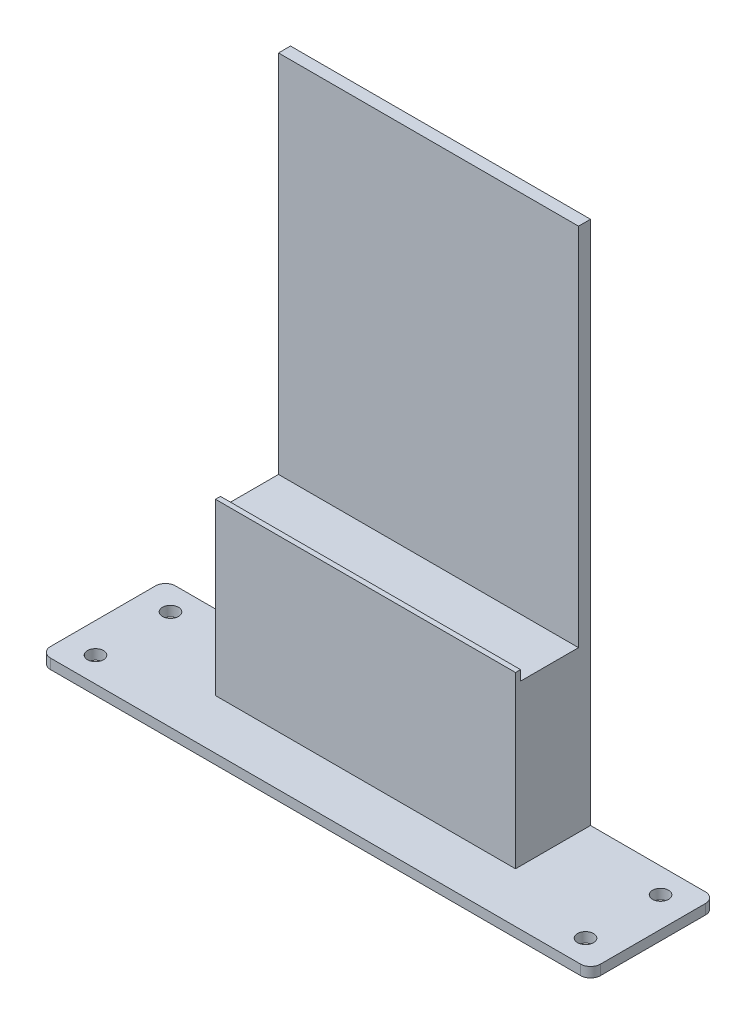
ISO-10303-21;
HEADER;
FILE_DESCRIPTION(('STEP AP214'),'2;1');
FILE_NAME('part.step','',(''),(''),'','','');
FILE_SCHEMA(('AUTOMOTIVE_DESIGN { 1 0 10303 214 1 1 1 1 }'));
ENDSEC;
DATA;
#1=APPLICATION_CONTEXT('core data for automotive mechanical design processes');
#2=APPLICATION_PROTOCOL_DEFINITION('international standard','automotive_design',2000,#1);
#3=PRODUCT_CONTEXT('',#1,'mechanical');
#4=PRODUCT('Part','Part','',(#3));
#5=PRODUCT_RELATED_PRODUCT_CATEGORY('part','',(#4));
#6=PRODUCT_DEFINITION_FORMATION('','',#4);
#7=PRODUCT_DEFINITION_CONTEXT('part definition',#1,'design');
#8=PRODUCT_DEFINITION('design','',#6,#7);
#9=PRODUCT_DEFINITION_SHAPE('','',#8);
#10=(LENGTH_UNIT() NAMED_UNIT(*) SI_UNIT(.MILLI.,.METRE.));
#11=(NAMED_UNIT(*) PLANE_ANGLE_UNIT() SI_UNIT($,.RADIAN.));
#12=(NAMED_UNIT(*) SI_UNIT($,.STERADIAN.) SOLID_ANGLE_UNIT());
#13=UNCERTAINTY_MEASURE_WITH_UNIT(LENGTH_MEASURE(1.E-05),#10,'distance_accuracy_value','');
#14=(GEOMETRIC_REPRESENTATION_CONTEXT(3) GLOBAL_UNCERTAINTY_ASSIGNED_CONTEXT((#13)) GLOBAL_UNIT_ASSIGNED_CONTEXT((#10,
#11,#12)) REPRESENTATION_CONTEXT('',''));
#15=CARTESIAN_POINT('',(0.,0.,0.));
#16=DIRECTION('',(0.,0.,1.));
#17=DIRECTION('',(1.,0.,0.));
#18=AXIS2_PLACEMENT_3D('',#15,#16,#17);
#19=CARTESIAN_POINT('',(-30.,-59.8465843842649,2.5));
#20=DIRECTION('',(0.,0.,1.));
#21=DIRECTION('',(1.,0.,0.));
#22=AXIS2_PLACEMENT_3D('',#19,#20,#21);
#23=PLANE('',#22);
#24=DIRECTION('',(1.,0.,0.));
#25=VECTOR('',#24,1.);
#26=CARTESIAN_POINT('',(-109.998499985937,36.,2.5));
#27=LINE('',#26,#25);
#28=CARTESIAN_POINT('',(-30.,36.,2.5));
#29=VERTEX_POINT('',#28);
#30=CARTESIAN_POINT('',(30.,36.,2.5));
#31=VERTEX_POINT('',#30);
#32=EDGE_CURVE('E176',#29,#31,#27,.T.);
#33=ORIENTED_EDGE('',*,*,#32,.F.);
#34=DIRECTION('',(0.,1.,0.));
#35=VECTOR('',#34,1.);
#36=CARTESIAN_POINT('',(-30.,-59.8465843842649,2.5));
#37=LINE('',#36,#35);
#38=CARTESIAN_POINT('',(-30.,2.,2.5));
#39=VERTEX_POINT('',#38);
#40=EDGE_CURVE('E216',#39,#29,#37,.T.);
#41=ORIENTED_EDGE('',*,*,#40,.F.);
#42=DIRECTION('',(-1.,0.,0.));
#43=VECTOR('',#42,1.);
#44=CARTESIAN_POINT('',(-30.,2.,2.5));
#45=LINE('',#44,#43);
#46=CARTESIAN_POINT('',(30.,2.,2.5));
#47=VERTEX_POINT('',#46);
#48=EDGE_CURVE('E199',#47,#39,#45,.T.);
#49=ORIENTED_EDGE('',*,*,#48,.F.);
#50=DIRECTION('',(0.,1.,0.));
#51=VECTOR('',#50,1.);
#52=CARTESIAN_POINT('',(30.,-59.8465843842649,2.5));
#53=LINE('',#52,#51);
#54=EDGE_CURVE('E212',#47,#31,#53,.T.);
#55=ORIENTED_EDGE('',*,*,#54,.T.);
#56=EDGE_LOOP('',(#33,#41,#49,#55));
#57=FACE_BOUND('',#56,.T.);
#58=ADVANCED_FACE('F38',(#57),#23,.T.);
#59=CARTESIAN_POINT('',(0.,2.,0.));
#60=DIRECTION('',(0.,1.,0.));
#61=DIRECTION('',(0.,0.,1.));
#62=AXIS2_PLACEMENT_3D('',#59,#60,#61);
#63=PLANE('',#62);
#64=CARTESIAN_POINT('',(49.,2.,7.5));
#65=DIRECTION('',(0.,1.,0.));
#66=DIRECTION('',(0.,0.,1.));
#67=AXIS2_PLACEMENT_3D('',#64,#65,#66);
#68=CIRCLE('',#67,1.6);
#69=CARTESIAN_POINT('',(49.,2.,9.1));
#70=VERTEX_POINT('',#69);
#71=EDGE_CURVE('E234',#70,#70,#68,.T.);
#72=ORIENTED_EDGE('',*,*,#71,.F.);
#73=EDGE_LOOP('',(#72));
#74=FACE_BOUND('',#73,.T.);
#75=CARTESIAN_POINT('',(-49.,2.,-7.5));
#76=DIRECTION('',(0.,1.,0.));
#77=DIRECTION('',(0.,0.,1.));
#78=AXIS2_PLACEMENT_3D('',#75,#76,#77);
#79=CIRCLE('',#78,1.6);
#80=CARTESIAN_POINT('',(-49.,2.,-5.9));
#81=VERTEX_POINT('',#80);
#82=EDGE_CURVE('E250',#81,#81,#79,.T.);
#83=ORIENTED_EDGE('',*,*,#82,.F.);
#84=EDGE_LOOP('',(#83));
#85=FACE_BOUND('',#84,.T.);
#86=CARTESIAN_POINT('',(49.,2.,-7.5));
#87=DIRECTION('',(0.,1.,0.));
#88=DIRECTION('',(0.,0.,-1.));
#89=AXIS2_PLACEMENT_3D('',#86,#87,#88);
#90=CIRCLE('',#89,1.6);
#91=CARTESIAN_POINT('',(49.,2.,-9.1));
#92=VERTEX_POINT('',#91);
#93=EDGE_CURVE('E242',#92,#92,#90,.T.);
#94=ORIENTED_EDGE('',*,*,#93,.F.);
#95=EDGE_LOOP('',(#94));
#96=FACE_BOUND('',#95,.T.);
#97=CARTESIAN_POINT('',(-49.,2.,7.5));
#98=DIRECTION('',(0.,1.,0.));
#99=DIRECTION('',(0.,0.,-1.));
#100=AXIS2_PLACEMENT_3D('',#97,#98,#99);
#101=CIRCLE('',#100,1.6);
#102=CARTESIAN_POINT('',(-49.,2.,5.9));
#103=VERTEX_POINT('',#102);
#104=EDGE_CURVE('E226',#103,#103,#101,.T.);
#105=ORIENTED_EDGE('',*,*,#104,.F.);
#106=EDGE_LOOP('',(#105));
#107=FACE_BOUND('',#106,.T.);
#108=DIRECTION('',(0.,0.,1.));
#109=VECTOR('',#108,1.);
#110=CARTESIAN_POINT('',(-55.,2.,-12.5));
#111=LINE('',#110,#109);
#112=CARTESIAN_POINT('',(-55.,2.,-10.5));
#113=VERTEX_POINT('',#112);
#114=CARTESIAN_POINT('',(-55.,2.,10.5));
#115=VERTEX_POINT('',#114);
#116=EDGE_CURVE('E267',#113,#115,#111,.T.);
#117=ORIENTED_EDGE('',*,*,#116,.T.);
#118=CARTESIAN_POINT('',(-53.,2.,10.5));
#119=DIRECTION('',(0.,1.,0.));
#120=DIRECTION('',(0.,0.,1.));
#121=AXIS2_PLACEMENT_3D('',#118,#119,#120);
#122=CIRCLE('',#121,2.);
#123=CARTESIAN_POINT('',(-53.,2.,12.5));
#124=VERTEX_POINT('',#123);
#125=EDGE_CURVE('E47',#115,#124,#122,.T.);
#126=ORIENTED_EDGE('',*,*,#125,.T.);
#127=DIRECTION('',(1.,0.,0.));
#128=VECTOR('',#127,1.);
#129=CARTESIAN_POINT('',(-55.,2.,12.5));
#130=LINE('',#129,#128);
#131=CARTESIAN_POINT('',(53.,2.,12.5));
#132=VERTEX_POINT('',#131);
#133=EDGE_CURVE('E270',#124,#132,#130,.T.);
#134=ORIENTED_EDGE('',*,*,#133,.T.);
#135=CARTESIAN_POINT('',(53.,2.,10.5));
#136=DIRECTION('',(0.,1.,0.));
#137=DIRECTION('',(0.,0.,1.));
#138=AXIS2_PLACEMENT_3D('',#135,#136,#137);
#139=CIRCLE('',#138,2.);
#140=CARTESIAN_POINT('',(55.,2.,10.5));
#141=VERTEX_POINT('',#140);
#142=EDGE_CURVE('E297',#132,#141,#139,.T.);
#143=ORIENTED_EDGE('',*,*,#142,.T.);
#144=DIRECTION('',(0.,0.,-1.));
#145=VECTOR('',#144,1.);
#146=CARTESIAN_POINT('',(55.,2.,-12.5));
#147=LINE('',#146,#145);
#148=CARTESIAN_POINT('',(55.,2.,-10.5));
#149=VERTEX_POINT('',#148);
#150=EDGE_CURVE('E258',#141,#149,#147,.T.);
#151=ORIENTED_EDGE('',*,*,#150,.T.);
#152=CARTESIAN_POINT('',(53.,2.,-10.5));
#153=DIRECTION('',(0.,1.,0.));
#154=DIRECTION('',(0.,0.,1.));
#155=AXIS2_PLACEMENT_3D('',#152,#153,#154);
#156=CIRCLE('',#155,2.);
#157=CARTESIAN_POINT('',(53.,2.,-12.5));
#158=VERTEX_POINT('',#157);
#159=EDGE_CURVE('E310',#149,#158,#156,.T.);
#160=ORIENTED_EDGE('',*,*,#159,.T.);
#161=DIRECTION('',(-1.,0.,0.));
#162=VECTOR('',#161,1.);
#163=CARTESIAN_POINT('',(-55.,2.,-12.5));
#164=LINE('',#163,#162);
#165=CARTESIAN_POINT('',(30.,2.,-12.5));
#166=VERTEX_POINT('',#165);
#167=EDGE_CURVE('E264',#158,#166,#164,.T.);
#168=ORIENTED_EDGE('',*,*,#167,.T.);
#169=DIRECTION('',(0.,0.,1.));
#170=VECTOR('',#169,1.);
#171=CARTESIAN_POINT('',(30.,2.,2.5));
#172=LINE('',#171,#170);
#173=EDGE_CURVE('E203',#166,#47,#172,.T.);
#174=ORIENTED_EDGE('',*,*,#173,.T.);
#175=ORIENTED_EDGE('',*,*,#48,.T.);
#176=DIRECTION('',(0.,0.,-1.));
#177=VECTOR('',#176,1.);
#178=CARTESIAN_POINT('',(-30.,2.,-12.5));
#179=LINE('',#178,#177);
#180=CARTESIAN_POINT('',(-30.,2.,-12.5));
#181=VERTEX_POINT('',#180);
#182=EDGE_CURVE('E208',#39,#181,#179,.T.);
#183=ORIENTED_EDGE('',*,*,#182,.T.);
#184=CARTESIAN_POINT('',(-53.,2.,-12.5));
#185=VERTEX_POINT('',#184);
#186=EDGE_CURVE('E262',#181,#185,#164,.T.);
#187=ORIENTED_EDGE('',*,*,#186,.T.);
#188=CARTESIAN_POINT('',(-53.,2.,-10.5));
#189=DIRECTION('',(0.,1.,0.));
#190=DIRECTION('',(0.,0.,1.));
#191=AXIS2_PLACEMENT_3D('',#188,#189,#190);
#192=CIRCLE('',#191,2.);
#193=EDGE_CURVE('E323',#185,#113,#192,.T.);
#194=ORIENTED_EDGE('',*,*,#193,.T.);
#195=EDGE_LOOP('',(#117,#126,#134,#143,#151,#160,#168,#174,#175,#183,#187,#194));
#196=FACE_BOUND('',#195,.T.);
#197=ADVANCED_FACE('F337',(#74,#85,#96,#107,#196),#63,.T.);
#198=CARTESIAN_POINT('',(0.,0.,0.));
#199=DIRECTION('',(0.,1.,0.));
#200=DIRECTION('',(0.,0.,1.));
#201=AXIS2_PLACEMENT_3D('',#198,#199,#200);
#202=PLANE('',#201);
#203=DIRECTION('',(1.,0.,0.));
#204=VECTOR('',#203,1.);
#205=CARTESIAN_POINT('',(-55.,0.,12.5));
#206=LINE('',#205,#204);
#207=CARTESIAN_POINT('',(-53.,0.,12.5));
#208=VERTEX_POINT('',#207);
#209=CARTESIAN_POINT('',(53.,0.,12.5));
#210=VERTEX_POINT('',#209);
#211=EDGE_CURVE('E263',#208,#210,#206,.T.);
#212=ORIENTED_EDGE('',*,*,#211,.F.);
#213=CARTESIAN_POINT('',(-53.,0.,10.5));
#214=DIRECTION('',(0.,1.,0.));
#215=DIRECTION('',(0.,0.,1.));
#216=AXIS2_PLACEMENT_3D('',#213,#214,#215);
#217=CIRCLE('',#216,2.);
#218=CARTESIAN_POINT('',(-55.,0.,10.5));
#219=VERTEX_POINT('',#218);
#220=EDGE_CURVE('E62',#208,#219,#217,.F.);
#221=ORIENTED_EDGE('',*,*,#220,.T.);
#222=DIRECTION('',(0.,0.,1.));
#223=VECTOR('',#222,1.);
#224=CARTESIAN_POINT('',(-55.,0.,-12.5));
#225=LINE('',#224,#223);
#226=CARTESIAN_POINT('',(-55.,0.,-10.5));
#227=VERTEX_POINT('',#226);
#228=EDGE_CURVE('E281',#227,#219,#225,.T.);
#229=ORIENTED_EDGE('',*,*,#228,.F.);
#230=CARTESIAN_POINT('',(-53.,0.,-10.5));
#231=DIRECTION('',(0.,1.,0.));
#232=DIRECTION('',(0.,0.,1.));
#233=AXIS2_PLACEMENT_3D('',#230,#231,#232);
#234=CIRCLE('',#233,2.);
#235=CARTESIAN_POINT('',(-53.,0.,-12.5));
#236=VERTEX_POINT('',#235);
#237=EDGE_CURVE('E317',#227,#236,#234,.F.);
#238=ORIENTED_EDGE('',*,*,#237,.T.);
#239=DIRECTION('',(-1.,0.,0.));
#240=VECTOR('',#239,1.);
#241=CARTESIAN_POINT('',(-55.,0.,-12.5));
#242=LINE('',#241,#240);
#243=CARTESIAN_POINT('',(53.,0.,-12.5));
#244=VERTEX_POINT('',#243);
#245=EDGE_CURVE('E277',#244,#236,#242,.T.);
#246=ORIENTED_EDGE('',*,*,#245,.F.);
#247=CARTESIAN_POINT('',(53.,0.,-10.5));
#248=DIRECTION('',(0.,1.,0.));
#249=DIRECTION('',(0.,0.,1.));
#250=AXIS2_PLACEMENT_3D('',#247,#248,#249);
#251=CIRCLE('',#250,2.);
#252=CARTESIAN_POINT('',(55.,0.,-10.5));
#253=VERTEX_POINT('',#252);
#254=EDGE_CURVE('E304',#244,#253,#251,.F.);
#255=ORIENTED_EDGE('',*,*,#254,.T.);
#256=DIRECTION('',(0.,0.,-1.));
#257=VECTOR('',#256,1.);
#258=CARTESIAN_POINT('',(55.,0.,-12.5));
#259=LINE('',#258,#257);
#260=CARTESIAN_POINT('',(55.,0.,10.5));
#261=VERTEX_POINT('',#260);
#262=EDGE_CURVE('E254',#261,#253,#259,.T.);
#263=ORIENTED_EDGE('',*,*,#262,.F.);
#264=CARTESIAN_POINT('',(53.,0.,10.5));
#265=DIRECTION('',(0.,1.,0.));
#266=DIRECTION('',(0.,0.,1.));
#267=AXIS2_PLACEMENT_3D('',#264,#265,#266);
#268=CIRCLE('',#267,2.);
#269=EDGE_CURVE('E289',#261,#210,#268,.F.);
#270=ORIENTED_EDGE('',*,*,#269,.T.);
#271=EDGE_LOOP('',(#212,#221,#229,#238,#246,#255,#263,#270));
#272=FACE_BOUND('',#271,.T.);
#273=CARTESIAN_POINT('',(-49.,0.,-7.5));
#274=DIRECTION('',(0.,1.,0.));
#275=DIRECTION('',(0.,0.,1.));
#276=AXIS2_PLACEMENT_3D('',#273,#274,#275);
#277=CIRCLE('',#276,1.6);
#278=CARTESIAN_POINT('',(-49.,0.,-5.9));
#279=VERTEX_POINT('',#278);
#280=EDGE_CURVE('E246',#279,#279,#277,.T.);
#281=ORIENTED_EDGE('',*,*,#280,.T.);
#282=EDGE_LOOP('',(#281));
#283=FACE_BOUND('',#282,.T.);
#284=CARTESIAN_POINT('',(49.,0.,-7.5));
#285=DIRECTION('',(0.,1.,0.));
#286=DIRECTION('',(0.,0.,-1.));
#287=AXIS2_PLACEMENT_3D('',#284,#285,#286);
#288=CIRCLE('',#287,1.6);
#289=CARTESIAN_POINT('',(49.,0.,-9.1));
#290=VERTEX_POINT('',#289);
#291=EDGE_CURVE('E238',#290,#290,#288,.T.);
#292=ORIENTED_EDGE('',*,*,#291,.T.);
#293=EDGE_LOOP('',(#292));
#294=FACE_BOUND('',#293,.T.);
#295=CARTESIAN_POINT('',(49.,0.,7.5));
#296=DIRECTION('',(0.,1.,0.));
#297=DIRECTION('',(0.,0.,1.));
#298=AXIS2_PLACEMENT_3D('',#295,#296,#297);
#299=CIRCLE('',#298,1.6);
#300=CARTESIAN_POINT('',(49.,0.,9.1));
#301=VERTEX_POINT('',#300);
#302=EDGE_CURVE('E230',#301,#301,#299,.T.);
#303=ORIENTED_EDGE('',*,*,#302,.T.);
#304=EDGE_LOOP('',(#303));
#305=FACE_BOUND('',#304,.T.);
#306=CARTESIAN_POINT('',(-49.,0.,7.5));
#307=DIRECTION('',(0.,1.,0.));
#308=DIRECTION('',(0.,0.,-1.));
#309=AXIS2_PLACEMENT_3D('',#306,#307,#308);
#310=CIRCLE('',#309,1.6);
#311=CARTESIAN_POINT('',(-49.,0.,5.9));
#312=VERTEX_POINT('',#311);
#313=EDGE_CURVE('E225',#312,#312,#310,.T.);
#314=ORIENTED_EDGE('',*,*,#313,.T.);
#315=EDGE_LOOP('',(#314));
#316=FACE_BOUND('',#315,.T.);
#317=ADVANCED_FACE('F359',(#272,#283,#294,#305,#316),#202,.F.);
#318=CARTESIAN_POINT('',(55.,2.,-12.5));
#319=DIRECTION('',(-1.,0.,0.));
#320=DIRECTION('',(0.,0.,1.));
#321=AXIS2_PLACEMENT_3D('',#318,#319,#320);
#322=PLANE('',#321);
#323=ORIENTED_EDGE('',*,*,#262,.T.);
#324=DIRECTION('',(0.,-1.,0.));
#325=VECTOR('',#324,1.);
#326=CARTESIAN_POINT('',(55.,2.,-10.5));
#327=LINE('',#326,#325);
#328=EDGE_CURVE('E307',#253,#149,#327,.F.);
#329=ORIENTED_EDGE('',*,*,#328,.T.);
#330=ORIENTED_EDGE('',*,*,#150,.F.);
#331=DIRECTION('',(0.,-1.,0.));
#332=VECTOR('',#331,1.);
#333=CARTESIAN_POINT('',(55.,2.,10.5));
#334=LINE('',#333,#332);
#335=EDGE_CURVE('E273',#141,#261,#334,.T.);
#336=ORIENTED_EDGE('',*,*,#335,.T.);
#337=EDGE_LOOP('',(#323,#329,#330,#336));
#338=FACE_BOUND('',#337,.T.);
#339=ADVANCED_FACE('F388',(#338),#322,.F.);
#340=CARTESIAN_POINT('',(-55.,2.,-12.5));
#341=DIRECTION('',(0.,0.,1.));
#342=DIRECTION('',(1.,0.,0.));
#343=AXIS2_PLACEMENT_3D('',#340,#341,#342);
#344=PLANE('',#343);
#345=DIRECTION('',(0.,1.,0.));
#346=VECTOR('',#345,1.);
#347=CARTESIAN_POINT('',(-30.,-59.8465843842649,-12.5));
#348=LINE('',#347,#346);
#349=CARTESIAN_POINT('',(-30.,107.,-12.5));
#350=VERTEX_POINT('',#349);
#351=EDGE_CURVE('E181',#181,#350,#348,.T.);
#352=ORIENTED_EDGE('',*,*,#351,.T.);
#353=DIRECTION('',(1.,0.,0.));
#354=VECTOR('',#353,1.);
#355=CARTESIAN_POINT('',(-55.,107.,-12.5));
#356=LINE('',#355,#354);
#357=CARTESIAN_POINT('',(30.,107.,-12.5));
#358=VERTEX_POINT('',#357);
#359=EDGE_CURVE('E158',#350,#358,#356,.T.);
#360=ORIENTED_EDGE('',*,*,#359,.T.);
#361=DIRECTION('',(0.,1.,0.));
#362=VECTOR('',#361,1.);
#363=CARTESIAN_POINT('',(30.,-59.8465843842649,-12.5));
#364=LINE('',#363,#362);
#365=EDGE_CURVE('E204',#166,#358,#364,.T.);
#366=ORIENTED_EDGE('',*,*,#365,.F.);
#367=ORIENTED_EDGE('',*,*,#167,.F.);
#368=DIRECTION('',(0.,-1.,0.));
#369=VECTOR('',#368,1.);
#370=CARTESIAN_POINT('',(53.,2.,-12.5));
#371=LINE('',#370,#369);
#372=EDGE_CURVE('E300',#158,#244,#371,.T.);
#373=ORIENTED_EDGE('',*,*,#372,.T.);
#374=ORIENTED_EDGE('',*,*,#245,.T.);
#375=DIRECTION('',(0.,-1.,0.));
#376=VECTOR('',#375,1.);
#377=CARTESIAN_POINT('',(-53.,2.,-12.5));
#378=LINE('',#377,#376);
#379=EDGE_CURVE('E320',#236,#185,#378,.F.);
#380=ORIENTED_EDGE('',*,*,#379,.T.);
#381=ORIENTED_EDGE('',*,*,#186,.F.);
#382=EDGE_LOOP('',(#352,#360,#366,#367,#373,#374,#380,#381));
#383=FACE_BOUND('',#382,.T.);
#384=ADVANCED_FACE('F394',(#383),#344,.F.);
#385=CARTESIAN_POINT('',(-55.,2.,-12.5));
#386=DIRECTION('',(1.,0.,0.));
#387=DIRECTION('',(0.,0.,-1.));
#388=AXIS2_PLACEMENT_3D('',#385,#386,#387);
#389=PLANE('',#388);
#390=ORIENTED_EDGE('',*,*,#228,.T.);
#391=DIRECTION('',(0.,-1.,0.));
#392=VECTOR('',#391,1.);
#393=CARTESIAN_POINT('',(-55.,2.,10.5));
#394=LINE('',#393,#392);
#395=EDGE_CURVE('E54',#219,#115,#394,.F.);
#396=ORIENTED_EDGE('',*,*,#395,.T.);
#397=ORIENTED_EDGE('',*,*,#116,.F.);
#398=DIRECTION('',(0.,-1.,0.));
#399=VECTOR('',#398,1.);
#400=CARTESIAN_POINT('',(-55.,2.,-10.5));
#401=LINE('',#400,#399);
#402=EDGE_CURVE('E313',#113,#227,#401,.T.);
#403=ORIENTED_EDGE('',*,*,#402,.T.);
#404=EDGE_LOOP('',(#390,#396,#397,#403));
#405=FACE_BOUND('',#404,.T.);
#406=ADVANCED_FACE('F391',(#405),#389,.F.);
#407=CARTESIAN_POINT('',(-55.,2.,12.5));
#408=DIRECTION('',(0.,0.,-1.));
#409=DIRECTION('',(-1.,0.,0.));
#410=AXIS2_PLACEMENT_3D('',#407,#408,#409);
#411=PLANE('',#410);
#412=ORIENTED_EDGE('',*,*,#133,.F.);
#413=DIRECTION('',(0.,-1.,0.));
#414=VECTOR('',#413,1.);
#415=CARTESIAN_POINT('',(-53.,2.,12.5));
#416=LINE('',#415,#414);
#417=EDGE_CURVE('E326',#124,#208,#416,.T.);
#418=ORIENTED_EDGE('',*,*,#417,.T.);
#419=ORIENTED_EDGE('',*,*,#211,.T.);
#420=DIRECTION('',(0.,-1.,0.));
#421=VECTOR('',#420,1.);
#422=CARTESIAN_POINT('',(53.,2.,12.5));
#423=LINE('',#422,#421);
#424=EDGE_CURVE('E293',#210,#132,#423,.F.);
#425=ORIENTED_EDGE('',*,*,#424,.T.);
#426=EDGE_LOOP('',(#412,#418,#419,#425));
#427=FACE_BOUND('',#426,.T.);
#428=ADVANCED_FACE('F341',(#427),#411,.F.);
#429=CARTESIAN_POINT('',(-49.,2.,-7.5));
#430=DIRECTION('',(0.,-1.,0.));
#431=DIRECTION('',(0.,0.,-1.));
#432=AXIS2_PLACEMENT_3D('',#429,#430,#431);
#433=CYLINDRICAL_SURFACE('',#432,1.6);
#434=ORIENTED_EDGE('',*,*,#82,.T.);
#435=EDGE_LOOP('',(#434));
#436=FACE_BOUND('',#435,.T.);
#437=ORIENTED_EDGE('',*,*,#280,.F.);
#438=EDGE_LOOP('',(#437));
#439=FACE_BOUND('',#438,.T.);
#440=ADVANCED_FACE('F381',(#436,#439),#433,.F.);
#441=CARTESIAN_POINT('',(49.,2.,-7.5));
#442=DIRECTION('',(0.,-1.,0.));
#443=DIRECTION('',(0.,0.,-1.));
#444=AXIS2_PLACEMENT_3D('',#441,#442,#443);
#445=CYLINDRICAL_SURFACE('',#444,1.6);
#446=ORIENTED_EDGE('',*,*,#93,.T.);
#447=EDGE_LOOP('',(#446));
#448=FACE_BOUND('',#447,.T.);
#449=ORIENTED_EDGE('',*,*,#291,.F.);
#450=EDGE_LOOP('',(#449));
#451=FACE_BOUND('',#450,.T.);
#452=ADVANCED_FACE('F377',(#448,#451),#445,.F.);
#453=CARTESIAN_POINT('',(49.,2.,7.5));
#454=DIRECTION('',(0.,-1.,0.));
#455=DIRECTION('',(0.,0.,-1.));
#456=AXIS2_PLACEMENT_3D('',#453,#454,#455);
#457=CYLINDRICAL_SURFACE('',#456,1.6);
#458=ORIENTED_EDGE('',*,*,#71,.T.);
#459=EDGE_LOOP('',(#458));
#460=FACE_BOUND('',#459,.T.);
#461=ORIENTED_EDGE('',*,*,#302,.F.);
#462=EDGE_LOOP('',(#461));
#463=FACE_BOUND('',#462,.T.);
#464=ADVANCED_FACE('F373',(#460,#463),#457,.F.);
#465=CARTESIAN_POINT('',(-49.,2.,7.5));
#466=DIRECTION('',(0.,-1.,0.));
#467=DIRECTION('',(0.,0.,-1.));
#468=AXIS2_PLACEMENT_3D('',#465,#466,#467);
#469=CYLINDRICAL_SURFACE('',#468,1.6);
#470=ORIENTED_EDGE('',*,*,#104,.T.);
#471=EDGE_LOOP('',(#470));
#472=FACE_BOUND('',#471,.T.);
#473=ORIENTED_EDGE('',*,*,#313,.F.);
#474=EDGE_LOOP('',(#473));
#475=FACE_BOUND('',#474,.T.);
#476=ADVANCED_FACE('F370',(#472,#475),#469,.F.);
#477=CARTESIAN_POINT('',(30.,-59.8465843842649,2.5));
#478=DIRECTION('',(1.,0.,0.));
#479=DIRECTION('',(0.,0.,-1.));
#480=AXIS2_PLACEMENT_3D('',#477,#478,#479);
#481=PLANE('',#480);
#482=DIRECTION('',(0.,0.,-1.));
#483=VECTOR('',#482,1.);
#484=CARTESIAN_POINT('',(30.,107.,-12.5));
#485=LINE('',#484,#483);
#486=CARTESIAN_POINT('',(30.,107.,-10.1));
#487=VERTEX_POINT('',#486);
#488=EDGE_CURVE('E169',#487,#358,#485,.T.);
#489=ORIENTED_EDGE('',*,*,#488,.F.);
#490=DIRECTION('',(0.,1.,0.));
#491=VECTOR('',#490,1.);
#492=CARTESIAN_POINT('',(30.,34.,-10.1));
#493=LINE('',#492,#491);
#494=CARTESIAN_POINT('',(30.,34.,-10.1));
#495=VERTEX_POINT('',#494);
#496=EDGE_CURVE('E167',#495,#487,#493,.T.);
#497=ORIENTED_EDGE('',*,*,#496,.F.);
#498=DIRECTION('',(0.,0.,-1.));
#499=VECTOR('',#498,1.);
#500=CARTESIAN_POINT('',(30.,34.,1.5));
#501=LINE('',#500,#499);
#502=CARTESIAN_POINT('',(30.,34.,1.5));
#503=VERTEX_POINT('',#502);
#504=EDGE_CURVE('E446',#503,#495,#501,.T.);
#505=ORIENTED_EDGE('',*,*,#504,.F.);
#506=DIRECTION('',(0.,-1.,0.));
#507=VECTOR('',#506,1.);
#508=CARTESIAN_POINT('',(30.,36.,1.5));
#509=LINE('',#508,#507);
#510=CARTESIAN_POINT('',(30.,36.,1.5));
#511=VERTEX_POINT('',#510);
#512=EDGE_CURVE('E450',#511,#503,#509,.T.);
#513=ORIENTED_EDGE('',*,*,#512,.F.);
#514=DIRECTION('',(0.,0.,-1.));
#515=VECTOR('',#514,1.);
#516=CARTESIAN_POINT('',(30.,36.,2.5));
#517=LINE('',#516,#515);
#518=EDGE_CURVE('E457',#31,#511,#517,.T.);
#519=ORIENTED_EDGE('',*,*,#518,.F.);
#520=ORIENTED_EDGE('',*,*,#54,.F.);
#521=ORIENTED_EDGE('',*,*,#173,.F.);
#522=ORIENTED_EDGE('',*,*,#365,.T.);
#523=EDGE_LOOP('',(#489,#497,#505,#513,#519,#520,#521,#522));
#524=FACE_BOUND('',#523,.T.);
#525=ADVANCED_FACE('F365',(#524),#481,.T.);
#526=CARTESIAN_POINT('',(-30.,-59.8465843842649,-12.5));
#527=DIRECTION('',(-1.,0.,0.));
#528=DIRECTION('',(0.,0.,1.));
#529=AXIS2_PLACEMENT_3D('',#526,#527,#528);
#530=PLANE('',#529);
#531=DIRECTION('',(0.,1.,0.));
#532=VECTOR('',#531,1.);
#533=CARTESIAN_POINT('',(-30.,34.,-10.1));
#534=LINE('',#533,#532);
#535=CARTESIAN_POINT('',(-30.,34.,-10.1));
#536=VERTEX_POINT('',#535);
#537=CARTESIAN_POINT('',(-30.,107.,-10.1));
#538=VERTEX_POINT('',#537);
#539=EDGE_CURVE('E164',#536,#538,#534,.T.);
#540=ORIENTED_EDGE('',*,*,#539,.T.);
#541=DIRECTION('',(0.,0.,1.));
#542=VECTOR('',#541,1.);
#543=CARTESIAN_POINT('',(-30.,107.,-12.5));
#544=LINE('',#543,#542);
#545=EDGE_CURVE('E11',#350,#538,#544,.T.);
#546=ORIENTED_EDGE('',*,*,#545,.F.);
#547=ORIENTED_EDGE('',*,*,#351,.F.);
#548=ORIENTED_EDGE('',*,*,#182,.F.);
#549=ORIENTED_EDGE('',*,*,#40,.T.);
#550=DIRECTION('',(0.,0.,-1.));
#551=VECTOR('',#550,1.);
#552=CARTESIAN_POINT('',(-30.,36.,2.5));
#553=LINE('',#552,#551);
#554=CARTESIAN_POINT('',(-30.,36.,1.5));
#555=VERTEX_POINT('',#554);
#556=EDGE_CURVE('E186',#29,#555,#553,.T.);
#557=ORIENTED_EDGE('',*,*,#556,.T.);
#558=DIRECTION('',(0.,-1.,0.));
#559=VECTOR('',#558,1.);
#560=CARTESIAN_POINT('',(-30.,36.,1.5));
#561=LINE('',#560,#559);
#562=CARTESIAN_POINT('',(-30.,34.,1.5));
#563=VERTEX_POINT('',#562);
#564=EDGE_CURVE('E191',#555,#563,#561,.T.);
#565=ORIENTED_EDGE('',*,*,#564,.T.);
#566=DIRECTION('',(0.,0.,-1.));
#567=VECTOR('',#566,1.);
#568=CARTESIAN_POINT('',(-30.,34.,1.5));
#569=LINE('',#568,#567);
#570=EDGE_CURVE('E174',#563,#536,#569,.T.);
#571=ORIENTED_EDGE('',*,*,#570,.T.);
#572=EDGE_LOOP('',(#540,#546,#547,#548,#549,#557,#565,#571));
#573=FACE_BOUND('',#572,.T.);
#574=ADVANCED_FACE('F172',(#573),#530,.T.);
#575=CARTESIAN_POINT('',(-109.998499985937,36.,2.5));
#576=DIRECTION('',(0.,-1.,0.));
#577=DIRECTION('',(0.,0.,-1.));
#578=AXIS2_PLACEMENT_3D('',#575,#576,#577);
#579=PLANE('',#578);
#580=ORIENTED_EDGE('',*,*,#32,.T.);
#581=ORIENTED_EDGE('',*,*,#518,.T.);
#582=DIRECTION('',(1.,0.,0.));
#583=VECTOR('',#582,1.);
#584=CARTESIAN_POINT('',(-109.998499985937,36.,1.5));
#585=LINE('',#584,#583);
#586=EDGE_CURVE('E193',#555,#511,#585,.T.);
#587=ORIENTED_EDGE('',*,*,#586,.F.);
#588=ORIENTED_EDGE('',*,*,#556,.F.);
#589=EDGE_LOOP('',(#580,#581,#587,#588));
#590=FACE_BOUND('',#589,.T.);
#591=ADVANCED_FACE('F369',(#590),#579,.F.);
#592=CARTESIAN_POINT('',(-109.998499985937,36.,1.5));
#593=DIRECTION('',(0.,0.,1.));
#594=DIRECTION('',(1.,0.,0.));
#595=AXIS2_PLACEMENT_3D('',#592,#593,#594);
#596=PLANE('',#595);
#597=ORIENTED_EDGE('',*,*,#586,.T.);
#598=ORIENTED_EDGE('',*,*,#512,.T.);
#599=DIRECTION('',(1.,0.,0.));
#600=VECTOR('',#599,1.);
#601=CARTESIAN_POINT('',(-109.998499985937,34.,1.5));
#602=LINE('',#601,#600);
#603=EDGE_CURVE('E190',#563,#503,#602,.T.);
#604=ORIENTED_EDGE('',*,*,#603,.F.);
#605=ORIENTED_EDGE('',*,*,#564,.F.);
#606=EDGE_LOOP('',(#597,#598,#604,#605));
#607=FACE_BOUND('',#606,.T.);
#608=ADVANCED_FACE('F466',(#607),#596,.F.);
#609=CARTESIAN_POINT('',(-109.998499985937,34.,1.5));
#610=DIRECTION('',(0.,-1.,0.));
#611=DIRECTION('',(0.,0.,-1.));
#612=AXIS2_PLACEMENT_3D('',#609,#610,#611);
#613=PLANE('',#612);
#614=ORIENTED_EDGE('',*,*,#603,.T.);
#615=ORIENTED_EDGE('',*,*,#504,.T.);
#616=DIRECTION('',(1.,0.,0.));
#617=VECTOR('',#616,1.);
#618=CARTESIAN_POINT('',(-109.998499985937,34.,-10.1));
#619=LINE('',#618,#617);
#620=EDGE_CURVE('E177',#536,#495,#619,.T.);
#621=ORIENTED_EDGE('',*,*,#620,.F.);
#622=ORIENTED_EDGE('',*,*,#570,.F.);
#623=EDGE_LOOP('',(#614,#615,#621,#622));
#624=FACE_BOUND('',#623,.T.);
#625=ADVANCED_FACE('F468',(#624),#613,.F.);
#626=CARTESIAN_POINT('',(-109.998499985937,34.,-10.1));
#627=DIRECTION('',(0.,0.,-1.));
#628=DIRECTION('',(-1.,0.,0.));
#629=AXIS2_PLACEMENT_3D('',#626,#627,#628);
#630=PLANE('',#629);
#631=ORIENTED_EDGE('',*,*,#496,.T.);
#632=DIRECTION('',(1.,0.,0.));
#633=VECTOR('',#632,1.);
#634=CARTESIAN_POINT('',(-30.,107.,-10.1));
#635=LINE('',#634,#633);
#636=EDGE_CURVE('E155',#538,#487,#635,.T.);
#637=ORIENTED_EDGE('',*,*,#636,.F.);
#638=ORIENTED_EDGE('',*,*,#539,.F.);
#639=ORIENTED_EDGE('',*,*,#620,.T.);
#640=EDGE_LOOP('',(#631,#637,#638,#639));
#641=FACE_BOUND('',#640,.T.);
#642=ADVANCED_FACE('F163',(#641),#630,.F.);
#643=CARTESIAN_POINT('',(53.,2.,10.5));
#644=DIRECTION('',(0.,-1.,0.));
#645=DIRECTION('',(0.,0.,-1.));
#646=AXIS2_PLACEMENT_3D('',#643,#644,#645);
#647=CYLINDRICAL_SURFACE('',#646,2.);
#648=ORIENTED_EDGE('',*,*,#142,.F.);
#649=ORIENTED_EDGE('',*,*,#424,.F.);
#650=ORIENTED_EDGE('',*,*,#269,.F.);
#651=ORIENTED_EDGE('',*,*,#335,.F.);
#652=EDGE_LOOP('',(#648,#649,#650,#651));
#653=FACE_BOUND('',#652,.T.);
#654=ADVANCED_FACE('F401',(#653),#647,.T.);
#655=CARTESIAN_POINT('',(53.,2.,-10.5));
#656=DIRECTION('',(0.,-1.,0.));
#657=DIRECTION('',(0.,0.,-1.));
#658=AXIS2_PLACEMENT_3D('',#655,#656,#657);
#659=CYLINDRICAL_SURFACE('',#658,2.);
#660=ORIENTED_EDGE('',*,*,#159,.F.);
#661=ORIENTED_EDGE('',*,*,#328,.F.);
#662=ORIENTED_EDGE('',*,*,#254,.F.);
#663=ORIENTED_EDGE('',*,*,#372,.F.);
#664=EDGE_LOOP('',(#660,#661,#662,#663));
#665=FACE_BOUND('',#664,.T.);
#666=ADVANCED_FACE('F351',(#665),#659,.T.);
#667=CARTESIAN_POINT('',(-53.,2.,-10.5));
#668=DIRECTION('',(0.,-1.,0.));
#669=DIRECTION('',(0.,0.,-1.));
#670=AXIS2_PLACEMENT_3D('',#667,#668,#669);
#671=CYLINDRICAL_SURFACE('',#670,2.);
#672=ORIENTED_EDGE('',*,*,#193,.F.);
#673=ORIENTED_EDGE('',*,*,#379,.F.);
#674=ORIENTED_EDGE('',*,*,#237,.F.);
#675=ORIENTED_EDGE('',*,*,#402,.F.);
#676=EDGE_LOOP('',(#672,#673,#674,#675));
#677=FACE_BOUND('',#676,.T.);
#678=ADVANCED_FACE('F345',(#677),#671,.T.);
#679=CARTESIAN_POINT('',(-53.,2.,10.5));
#680=DIRECTION('',(0.,-1.,0.));
#681=DIRECTION('',(0.,0.,-1.));
#682=AXIS2_PLACEMENT_3D('',#679,#680,#681);
#683=CYLINDRICAL_SURFACE('',#682,2.);
#684=ORIENTED_EDGE('',*,*,#125,.F.);
#685=ORIENTED_EDGE('',*,*,#395,.F.);
#686=ORIENTED_EDGE('',*,*,#220,.F.);
#687=ORIENTED_EDGE('',*,*,#417,.F.);
#688=EDGE_LOOP('',(#684,#685,#686,#687));
#689=FACE_BOUND('',#688,.T.);
#690=ADVANCED_FACE('F40',(#689),#683,.T.);
#691=CARTESIAN_POINT('',(-55.,107.,-12.5));
#692=DIRECTION('',(0.,-1.,0.));
#693=DIRECTION('',(0.,0.,-1.));
#694=AXIS2_PLACEMENT_3D('',#691,#692,#693);
#695=PLANE('',#694);
#696=ORIENTED_EDGE('',*,*,#545,.T.);
#697=ORIENTED_EDGE('',*,*,#636,.T.);
#698=ORIENTED_EDGE('',*,*,#488,.T.);
#699=ORIENTED_EDGE('',*,*,#359,.F.);
#700=EDGE_LOOP('',(#696,#697,#698,#699));
#701=FACE_BOUND('',#700,.T.);
#702=ADVANCED_FACE('F154',(#701),#695,.F.);
#703=CLOSED_SHELL('',(#58,#197,#317,#339,#384,#406,#428,#440,#452,#464,#476,#525,#574,#591,#608,
#625,#642,#654,#666,#678,#690,#702));
#704=MANIFOLD_SOLID_BREP('B2',#703);
#705=ADVANCED_BREP_SHAPE_REPRESENTATION('',(#18,#704),#14);
#706=SHAPE_DEFINITION_REPRESENTATION(#9,#705);
ENDSEC;
END-ISO-10303-21;
